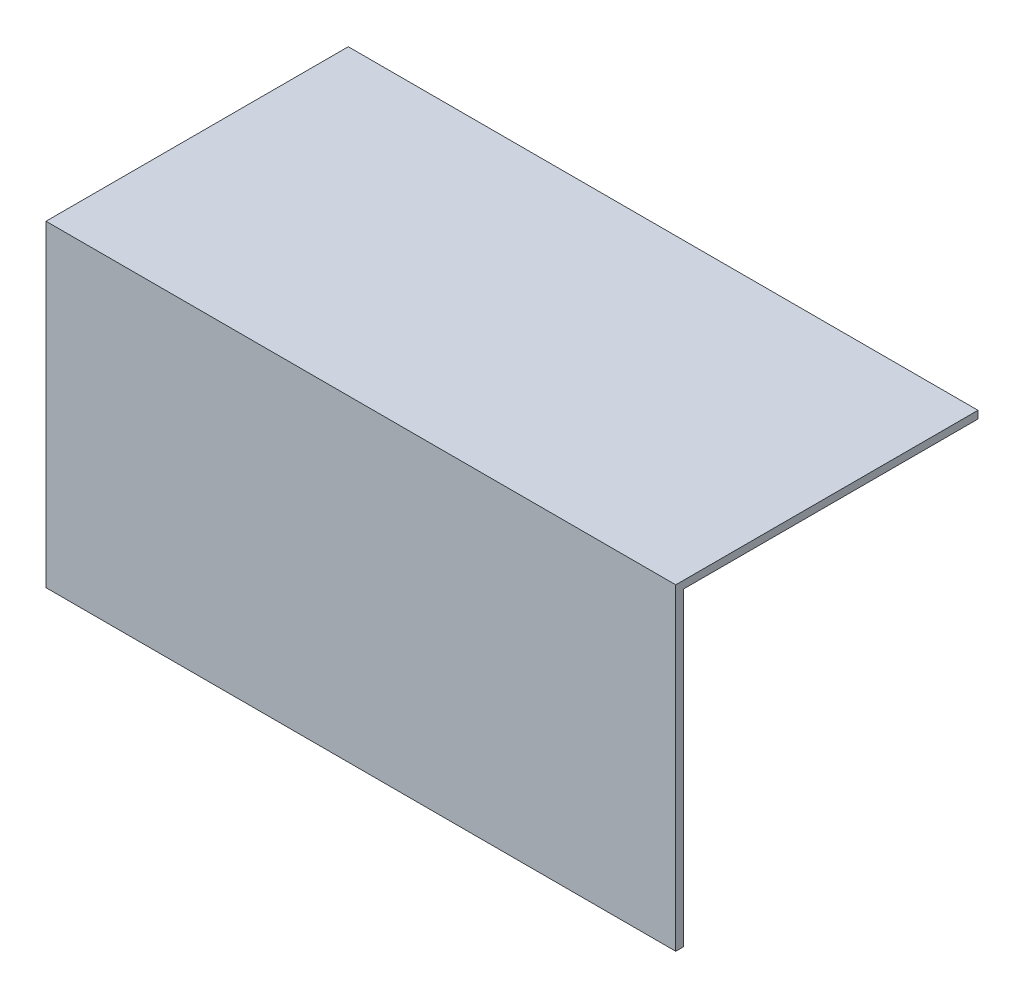
ISO-10303-21;
HEADER;
FILE_DESCRIPTION(('STEP AP214'),'2;1');
FILE_NAME('part.step','',(''),(''),'','','');
FILE_SCHEMA(('AUTOMOTIVE_DESIGN { 1 0 10303 214 1 1 1 1 }'));
ENDSEC;
DATA;
#1=APPLICATION_CONTEXT('core data for automotive mechanical design processes');
#2=APPLICATION_PROTOCOL_DEFINITION('international standard','automotive_design',2000,#1);
#3=PRODUCT_CONTEXT('',#1,'mechanical');
#4=PRODUCT('Part','Part','',(#3));
#5=PRODUCT_RELATED_PRODUCT_CATEGORY('part','',(#4));
#6=PRODUCT_DEFINITION_FORMATION('','',#4);
#7=PRODUCT_DEFINITION_CONTEXT('part definition',#1,'design');
#8=PRODUCT_DEFINITION('design','',#6,#7);
#9=PRODUCT_DEFINITION_SHAPE('','',#8);
#10=(LENGTH_UNIT() NAMED_UNIT(*) SI_UNIT(.MILLI.,.METRE.));
#11=(NAMED_UNIT(*) PLANE_ANGLE_UNIT() SI_UNIT($,.RADIAN.));
#12=(NAMED_UNIT(*) SI_UNIT($,.STERADIAN.) SOLID_ANGLE_UNIT());
#13=UNCERTAINTY_MEASURE_WITH_UNIT(LENGTH_MEASURE(1.E-05),#10,'distance_accuracy_value','');
#14=(GEOMETRIC_REPRESENTATION_CONTEXT(3) GLOBAL_UNCERTAINTY_ASSIGNED_CONTEXT((#13)) GLOBAL_UNIT_ASSIGNED_CONTEXT((#10,
#11,#12)) REPRESENTATION_CONTEXT('',''));
#15=CARTESIAN_POINT('',(0.,0.,0.));
#16=DIRECTION('',(0.,0.,1.));
#17=DIRECTION('',(1.,0.,0.));
#18=AXIS2_PLACEMENT_3D('',#15,#16,#17);
#19=CARTESIAN_POINT('',(-125.,-60.,153.));
#20=DIRECTION('',(1.,0.,0.));
#21=DIRECTION('',(0.,1.,0.));
#22=AXIS2_PLACEMENT_3D('',#19,#20,#21);
#23=PLANE('',#22);
#24=DIRECTION('',(0.,-1.,0.));
#25=VECTOR('',#24,1.);
#26=CARTESIAN_POINT('',(-125.,-60.,150.));
#27=LINE('',#26,#25);
#28=CARTESIAN_POINT('',(-125.,63.,150.));
#29=VERTEX_POINT('',#28);
#30=CARTESIAN_POINT('',(-125.,-60.,150.));
#31=VERTEX_POINT('',#30);
#32=EDGE_CURVE('E102',#29,#31,#27,.T.);
#33=ORIENTED_EDGE('',*,*,#32,.T.);
#34=DIRECTION('',(0.,0.,-1.));
#35=VECTOR('',#34,1.);
#36=CARTESIAN_POINT('',(-125.,-60.,153.));
#37=LINE('',#36,#35);
#38=CARTESIAN_POINT('',(-125.,-60.,153.));
#39=VERTEX_POINT('',#38);
#40=EDGE_CURVE('E11',#39,#31,#37,.T.);
#41=ORIENTED_EDGE('',*,*,#40,.F.);
#42=DIRECTION('',(0.,-1.,0.));
#43=VECTOR('',#42,1.);
#44=CARTESIAN_POINT('',(-125.,-60.,153.));
#45=LINE('',#44,#43);
#46=CARTESIAN_POINT('',(-125.,66.,153.));
#47=VERTEX_POINT('',#46);
#48=EDGE_CURVE('E107',#47,#39,#45,.T.);
#49=ORIENTED_EDGE('',*,*,#48,.F.);
#50=DIRECTION('',(0.,0.,1.));
#51=VECTOR('',#50,1.);
#52=CARTESIAN_POINT('',(-125.,66.,153.));
#53=LINE('',#52,#51);
#54=CARTESIAN_POINT('',(-125.,66.,33.));
#55=VERTEX_POINT('',#54);
#56=EDGE_CURVE('E118',#55,#47,#53,.T.);
#57=ORIENTED_EDGE('',*,*,#56,.F.);
#58=DIRECTION('',(0.,-1.,0.));
#59=VECTOR('',#58,1.);
#60=CARTESIAN_POINT('',(-125.,66.,33.));
#61=LINE('',#60,#59);
#62=CARTESIAN_POINT('',(-125.,63.,33.));
#63=VERTEX_POINT('',#62);
#64=EDGE_CURVE('E123',#55,#63,#61,.T.);
#65=ORIENTED_EDGE('',*,*,#64,.T.);
#66=DIRECTION('',(0.,0.,1.));
#67=VECTOR('',#66,1.);
#68=CARTESIAN_POINT('',(-125.,63.,153.));
#69=LINE('',#68,#67);
#70=EDGE_CURVE('E114',#63,#29,#69,.T.);
#71=ORIENTED_EDGE('',*,*,#70,.T.);
#72=EDGE_LOOP('',(#33,#41,#49,#57,#65,#71));
#73=FACE_BOUND('',#72,.T.);
#74=ADVANCED_FACE('F51',(#73),#23,.F.);
#75=CARTESIAN_POINT('',(-125.,-60.,153.));
#76=DIRECTION('',(0.,1.,0.));
#77=DIRECTION('',(0.,0.,1.));
#78=AXIS2_PLACEMENT_3D('',#75,#76,#77);
#79=PLANE('',#78);
#80=DIRECTION('',(1.,0.,0.));
#81=VECTOR('',#80,1.);
#82=CARTESIAN_POINT('',(-125.,-60.,150.));
#83=LINE('',#82,#81);
#84=CARTESIAN_POINT('',(125.,-60.,150.));
#85=VERTEX_POINT('',#84);
#86=EDGE_CURVE('E79',#31,#85,#83,.T.);
#87=ORIENTED_EDGE('',*,*,#86,.T.);
#88=DIRECTION('',(0.,0.,-1.));
#89=VECTOR('',#88,1.);
#90=CARTESIAN_POINT('',(125.,-60.,153.));
#91=LINE('',#90,#89);
#92=CARTESIAN_POINT('',(125.,-60.,153.));
#93=VERTEX_POINT('',#92);
#94=EDGE_CURVE('E60',#93,#85,#91,.T.);
#95=ORIENTED_EDGE('',*,*,#94,.F.);
#96=DIRECTION('',(1.,0.,0.));
#97=VECTOR('',#96,1.);
#98=CARTESIAN_POINT('',(-125.,-60.,153.));
#99=LINE('',#98,#97);
#100=EDGE_CURVE('E68',#39,#93,#99,.T.);
#101=ORIENTED_EDGE('',*,*,#100,.F.);
#102=ORIENTED_EDGE('',*,*,#40,.T.);
#103=EDGE_LOOP('',(#87,#95,#101,#102));
#104=FACE_BOUND('',#103,.T.);
#105=ADVANCED_FACE('F179',(#104),#79,.F.);
#106=CARTESIAN_POINT('',(125.,-60.,153.));
#107=DIRECTION('',(-1.,0.,0.));
#108=DIRECTION('',(0.,-1.,0.));
#109=AXIS2_PLACEMENT_3D('',#106,#107,#108);
#110=PLANE('',#109);
#111=DIRECTION('',(0.,1.,0.));
#112=VECTOR('',#111,1.);
#113=CARTESIAN_POINT('',(125.,-60.,150.));
#114=LINE('',#113,#112);
#115=CARTESIAN_POINT('',(125.,63.,150.));
#116=VERTEX_POINT('',#115);
#117=EDGE_CURVE('E85',#85,#116,#114,.T.);
#118=ORIENTED_EDGE('',*,*,#117,.T.);
#119=DIRECTION('',(0.,0.,-1.));
#120=VECTOR('',#119,1.);
#121=CARTESIAN_POINT('',(125.,63.,153.));
#122=LINE('',#121,#120);
#123=CARTESIAN_POINT('',(125.,63.,33.));
#124=VERTEX_POINT('',#123);
#125=EDGE_CURVE('E91',#116,#124,#122,.T.);
#126=ORIENTED_EDGE('',*,*,#125,.T.);
#127=DIRECTION('',(0.,-1.,0.));
#128=VECTOR('',#127,1.);
#129=CARTESIAN_POINT('',(125.,66.,33.));
#130=LINE('',#129,#128);
#131=CARTESIAN_POINT('',(125.,66.,33.));
#132=VERTEX_POINT('',#131);
#133=EDGE_CURVE('E127',#132,#124,#130,.T.);
#134=ORIENTED_EDGE('',*,*,#133,.F.);
#135=DIRECTION('',(0.,0.,-1.));
#136=VECTOR('',#135,1.);
#137=CARTESIAN_POINT('',(125.,66.,153.));
#138=LINE('',#137,#136);
#139=CARTESIAN_POINT('',(125.,66.,153.));
#140=VERTEX_POINT('',#139);
#141=EDGE_CURVE('E145',#140,#132,#138,.T.);
#142=ORIENTED_EDGE('',*,*,#141,.F.);
#143=DIRECTION('',(0.,1.,0.));
#144=VECTOR('',#143,1.);
#145=CARTESIAN_POINT('',(125.,-60.,153.));
#146=LINE('',#145,#144);
#147=EDGE_CURVE('E135',#93,#140,#146,.T.);
#148=ORIENTED_EDGE('',*,*,#147,.F.);
#149=ORIENTED_EDGE('',*,*,#94,.T.);
#150=EDGE_LOOP('',(#118,#126,#134,#142,#148,#149));
#151=FACE_BOUND('',#150,.T.);
#152=ADVANCED_FACE('F87',(#151),#110,.F.);
#153=CARTESIAN_POINT('',(0.,0.,153.));
#154=DIRECTION('',(0.,0.,-1.));
#155=DIRECTION('',(-1.,0.,0.));
#156=AXIS2_PLACEMENT_3D('',#153,#154,#155);
#157=PLANE('',#156);
#158=ORIENTED_EDGE('',*,*,#48,.T.);
#159=ORIENTED_EDGE('',*,*,#100,.T.);
#160=ORIENTED_EDGE('',*,*,#147,.T.);
#161=DIRECTION('',(1.,0.,0.));
#162=VECTOR('',#161,1.);
#163=CARTESIAN_POINT('',(-125.,66.,153.));
#164=LINE('',#163,#162);
#165=EDGE_CURVE('E148',#47,#140,#164,.T.);
#166=ORIENTED_EDGE('',*,*,#165,.F.);
#167=EDGE_LOOP('',(#158,#159,#160,#166));
#168=FACE_BOUND('',#167,.T.);
#169=ADVANCED_FACE('F178',(#168),#157,.F.);
#170=CARTESIAN_POINT('',(0.,0.,150.));
#171=DIRECTION('',(0.,0.,-1.));
#172=DIRECTION('',(-1.,0.,0.));
#173=AXIS2_PLACEMENT_3D('',#170,#171,#172);
#174=PLANE('',#173);
#175=ORIENTED_EDGE('',*,*,#32,.F.);
#176=DIRECTION('',(-1.,0.,0.));
#177=VECTOR('',#176,1.);
#178=CARTESIAN_POINT('',(-125.,63.,150.));
#179=LINE('',#178,#177);
#180=EDGE_CURVE('E96',#116,#29,#179,.T.);
#181=ORIENTED_EDGE('',*,*,#180,.F.);
#182=ORIENTED_EDGE('',*,*,#117,.F.);
#183=ORIENTED_EDGE('',*,*,#86,.F.);
#184=EDGE_LOOP('',(#175,#181,#182,#183));
#185=FACE_BOUND('',#184,.T.);
#186=ADVANCED_FACE('F100',(#185),#174,.T.);
#187=CARTESIAN_POINT('',(-125.,66.,33.));
#188=DIRECTION('',(0.,0.,1.));
#189=DIRECTION('',(1.,0.,0.));
#190=AXIS2_PLACEMENT_3D('',#187,#188,#189);
#191=PLANE('',#190);
#192=DIRECTION('',(-1.,0.,0.));
#193=VECTOR('',#192,1.);
#194=CARTESIAN_POINT('',(-125.,63.,33.));
#195=LINE('',#194,#193);
#196=EDGE_CURVE('E112',#124,#63,#195,.T.);
#197=ORIENTED_EDGE('',*,*,#196,.T.);
#198=ORIENTED_EDGE('',*,*,#64,.F.);
#199=DIRECTION('',(-1.,0.,0.));
#200=VECTOR('',#199,1.);
#201=CARTESIAN_POINT('',(-125.,66.,33.));
#202=LINE('',#201,#200);
#203=EDGE_CURVE('E128',#132,#55,#202,.T.);
#204=ORIENTED_EDGE('',*,*,#203,.F.);
#205=ORIENTED_EDGE('',*,*,#133,.T.);
#206=EDGE_LOOP('',(#197,#198,#204,#205));
#207=FACE_BOUND('',#206,.T.);
#208=ADVANCED_FACE('F177',(#207),#191,.F.);
#209=CARTESIAN_POINT('',(0.,66.,0.));
#210=DIRECTION('',(0.,-1.,0.));
#211=DIRECTION('',(0.,0.,-1.));
#212=AXIS2_PLACEMENT_3D('',#209,#210,#211);
#213=PLANE('',#212);
#214=ORIENTED_EDGE('',*,*,#56,.T.);
#215=ORIENTED_EDGE('',*,*,#165,.T.);
#216=ORIENTED_EDGE('',*,*,#141,.T.);
#217=ORIENTED_EDGE('',*,*,#203,.T.);
#218=EDGE_LOOP('',(#214,#215,#216,#217));
#219=FACE_BOUND('',#218,.T.);
#220=ADVANCED_FACE('F158',(#219),#213,.F.);
#221=CARTESIAN_POINT('',(0.,63.,0.));
#222=DIRECTION('',(0.,-1.,0.));
#223=DIRECTION('',(0.,0.,-1.));
#224=AXIS2_PLACEMENT_3D('',#221,#222,#223);
#225=PLANE('',#224);
#226=ORIENTED_EDGE('',*,*,#125,.F.);
#227=ORIENTED_EDGE('',*,*,#180,.T.);
#228=ORIENTED_EDGE('',*,*,#70,.F.);
#229=ORIENTED_EDGE('',*,*,#196,.F.);
#230=EDGE_LOOP('',(#226,#227,#228,#229));
#231=FACE_BOUND('',#230,.T.);
#232=ADVANCED_FACE('F110',(#231),#225,.T.);
#233=CLOSED_SHELL('',(#74,#105,#152,#169,#186,#208,#220,#232));
#234=MANIFOLD_SOLID_BREP('B2',#233);
#235=ADVANCED_BREP_SHAPE_REPRESENTATION('',(#18,#234),#14);
#236=SHAPE_DEFINITION_REPRESENTATION(#9,#235);
ENDSEC;
END-ISO-10303-21;
